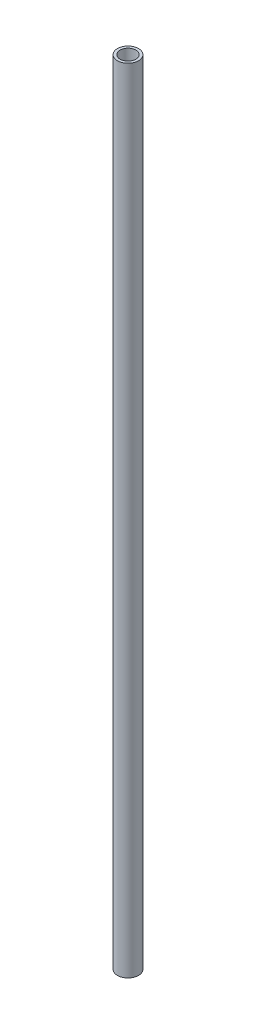
ISO-10303-21;
HEADER;
FILE_DESCRIPTION(('STEP AP214'),'2;1');
FILE_NAME('part.step','',(''),(''),'','','');
FILE_SCHEMA(('AUTOMOTIVE_DESIGN { 1 0 10303 214 1 1 1 1 }'));
ENDSEC;
DATA;
#1=APPLICATION_CONTEXT('core data for automotive mechanical design processes');
#2=APPLICATION_PROTOCOL_DEFINITION('international standard','automotive_design',2000,#1);
#3=PRODUCT_CONTEXT('',#1,'mechanical');
#4=PRODUCT('Part','Part','',(#3));
#5=PRODUCT_RELATED_PRODUCT_CATEGORY('part','',(#4));
#6=PRODUCT_DEFINITION_FORMATION('','',#4);
#7=PRODUCT_DEFINITION_CONTEXT('part definition',#1,'design');
#8=PRODUCT_DEFINITION('design','',#6,#7);
#9=PRODUCT_DEFINITION_SHAPE('','',#8);
#10=(LENGTH_UNIT() NAMED_UNIT(*) SI_UNIT(.MILLI.,.METRE.));
#11=(NAMED_UNIT(*) PLANE_ANGLE_UNIT() SI_UNIT($,.RADIAN.));
#12=(NAMED_UNIT(*) SI_UNIT($,.STERADIAN.) SOLID_ANGLE_UNIT());
#13=UNCERTAINTY_MEASURE_WITH_UNIT(LENGTH_MEASURE(1.E-05),#10,'distance_accuracy_value','');
#14=(GEOMETRIC_REPRESENTATION_CONTEXT(3) GLOBAL_UNCERTAINTY_ASSIGNED_CONTEXT((#13)) GLOBAL_UNIT_ASSIGNED_CONTEXT((#10,
#11,#12)) REPRESENTATION_CONTEXT('',''));
#15=CARTESIAN_POINT('',(0.,0.,0.));
#16=DIRECTION('',(0.,0.,1.));
#17=DIRECTION('',(1.,0.,0.));
#18=AXIS2_PLACEMENT_3D('',#15,#16,#17);
#19=CARTESIAN_POINT('',(0.,0.,0.));
#20=DIRECTION('',(0.,1.,0.));
#21=DIRECTION('',(0.,0.,0.999999999999999));
#22=AXIS2_PLACEMENT_3D('',#19,#20,#21);
#23=CYLINDRICAL_SURFACE('',#22,4.);
#24=CARTESIAN_POINT('',(6.66133814775094E-13,299.999999999999,0.));
#25=DIRECTION('',(0.,1.,0.));
#26=DIRECTION('',(0.,0.,0.999999999999999));
#27=AXIS2_PLACEMENT_3D('',#24,#25,#26);
#28=CIRCLE('',#27,4.);
#29=CARTESIAN_POINT('',(8.88178419700125E-13,299.999999999998,4.00000000000006));
#30=VERTEX_POINT('',#29);
#31=EDGE_CURVE('E48',#30,#30,#28,.T.);
#32=ORIENTED_EDGE('',*,*,#31,.F.);
#33=EDGE_LOOP('',(#32));
#34=FACE_BOUND('',#33,.T.);
#35=CARTESIAN_POINT('',(0.,0.,0.));
#36=DIRECTION('',(0.,1.,0.));
#37=DIRECTION('',(0.,0.,0.999999999999999));
#38=AXIS2_PLACEMENT_3D('',#35,#36,#37);
#39=CIRCLE('',#38,4.);
#40=CARTESIAN_POINT('',(-2.22044604925031E-13,0.,3.99999999999995));
#41=VERTEX_POINT('',#40);
#42=EDGE_CURVE('E33',#41,#41,#39,.T.);
#43=ORIENTED_EDGE('',*,*,#42,.T.);
#44=EDGE_LOOP('',(#43));
#45=FACE_BOUND('',#44,.T.);
#46=ADVANCED_FACE('F30',(#34,#45),#23,.T.);
#47=CARTESIAN_POINT('',(0.,0.,0.));
#48=DIRECTION('',(0.,1.,0.));
#49=DIRECTION('',(0.,0.,0.999999999999999));
#50=AXIS2_PLACEMENT_3D('',#47,#48,#49);
#51=PLANE('',#50);
#52=CARTESIAN_POINT('',(0.,0.,0.));
#53=DIRECTION('',(0.,1.,0.));
#54=DIRECTION('',(0.,0.,0.999999999999999));
#55=AXIS2_PLACEMENT_3D('',#52,#53,#54);
#56=CIRCLE('',#55,3.);
#57=CARTESIAN_POINT('',(-1.55431223447522E-12,0.,3.00000000000011));
#58=VERTEX_POINT('',#57);
#59=EDGE_CURVE('E38',#58,#58,#56,.F.);
#60=ORIENTED_EDGE('',*,*,#59,.F.);
#61=EDGE_LOOP('',(#60));
#62=FACE_BOUND('',#61,.T.);
#63=ORIENTED_EDGE('',*,*,#42,.F.);
#64=EDGE_LOOP('',(#63));
#65=FACE_BOUND('',#64,.T.);
#66=ADVANCED_FACE('F66',(#62,#65),#51,.F.);
#67=CARTESIAN_POINT('',(6.66133814775094E-13,299.999999999999,0.));
#68=DIRECTION('',(0.,1.,0.));
#69=DIRECTION('',(0.,0.,0.999999999999999));
#70=AXIS2_PLACEMENT_3D('',#67,#68,#69);
#71=PLANE('',#70);
#72=CARTESIAN_POINT('',(6.66133814775094E-13,299.999999999999,0.));
#73=DIRECTION('',(0.,1.,0.));
#74=DIRECTION('',(0.,0.,0.999999999999999));
#75=AXIS2_PLACEMENT_3D('',#72,#73,#74);
#76=CIRCLE('',#75,3.);
#77=CARTESIAN_POINT('',(6.66133814775094E-13,300.,3.00000000000017));
#78=VERTEX_POINT('',#77);
#79=EDGE_CURVE('E11',#78,#78,#76,.F.);
#80=ORIENTED_EDGE('',*,*,#79,.T.);
#81=EDGE_LOOP('',(#80));
#82=FACE_BOUND('',#81,.T.);
#83=ORIENTED_EDGE('',*,*,#31,.T.);
#84=EDGE_LOOP('',(#83));
#85=FACE_BOUND('',#84,.T.);
#86=ADVANCED_FACE('F55',(#82,#85),#71,.T.);
#87=CARTESIAN_POINT('',(0.,0.,0.));
#88=DIRECTION('',(0.,1.,0.));
#89=DIRECTION('',(0.,0.,0.999999999999999));
#90=AXIS2_PLACEMENT_3D('',#87,#88,#89);
#91=CYLINDRICAL_SURFACE('',#90,3.);
#92=ORIENTED_EDGE('',*,*,#79,.F.);
#93=EDGE_LOOP('',(#92));
#94=FACE_BOUND('',#93,.T.);
#95=ORIENTED_EDGE('',*,*,#59,.T.);
#96=EDGE_LOOP('',(#95));
#97=FACE_BOUND('',#96,.T.);
#98=ADVANCED_FACE('F58',(#94,#97),#91,.F.);
#99=CLOSED_SHELL('',(#46,#66,#86,#98));
#100=MANIFOLD_SOLID_BREP('B2',#99);
#101=ADVANCED_BREP_SHAPE_REPRESENTATION('',(#18,#100),#14);
#102=SHAPE_DEFINITION_REPRESENTATION(#9,#101);
ENDSEC;
END-ISO-10303-21;
